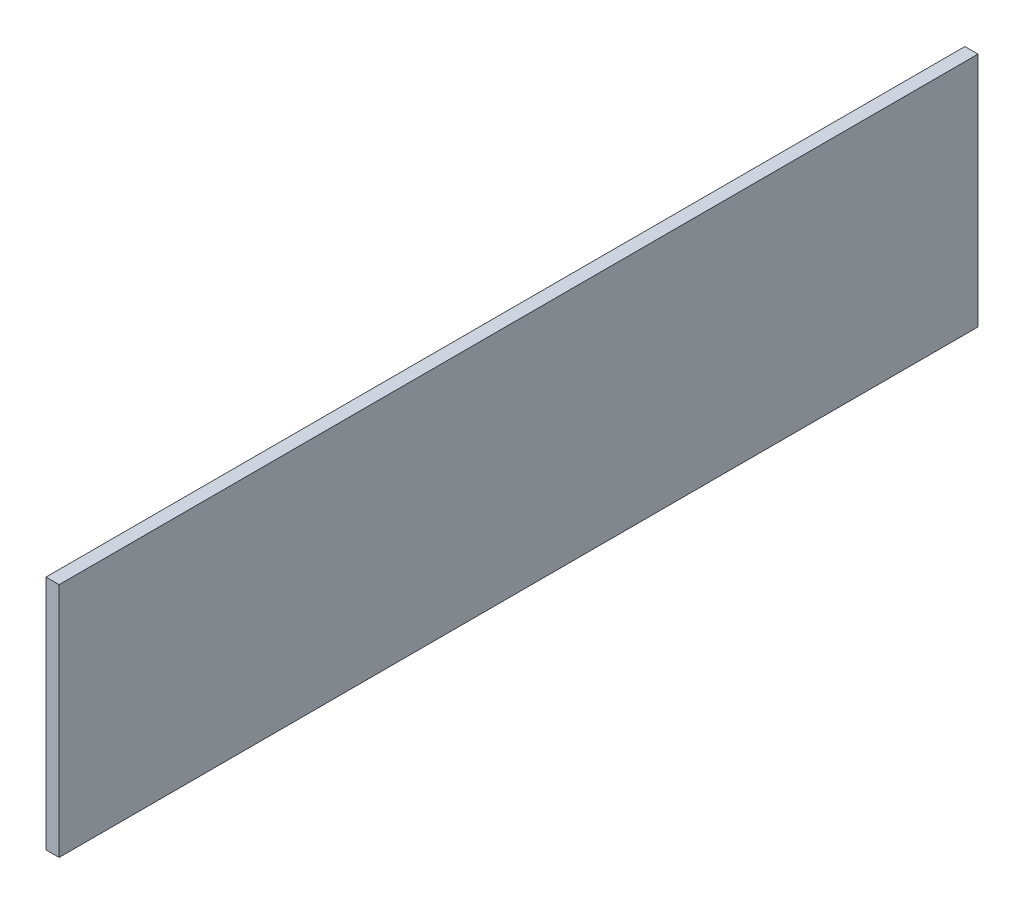
ISO-10303-21;
HEADER;
FILE_DESCRIPTION(('STEP AP214'),'2;1');
FILE_NAME('part.step','',(''),(''),'','','');
FILE_SCHEMA(('AUTOMOTIVE_DESIGN { 1 0 10303 214 1 1 1 1 }'));
ENDSEC;
DATA;
#1=APPLICATION_CONTEXT('core data for automotive mechanical design processes');
#2=APPLICATION_PROTOCOL_DEFINITION('international standard','automotive_design',2000,#1);
#3=PRODUCT_CONTEXT('',#1,'mechanical');
#4=PRODUCT('Part','Part','',(#3));
#5=PRODUCT_RELATED_PRODUCT_CATEGORY('part','',(#4));
#6=PRODUCT_DEFINITION_FORMATION('','',#4);
#7=PRODUCT_DEFINITION_CONTEXT('part definition',#1,'design');
#8=PRODUCT_DEFINITION('design','',#6,#7);
#9=PRODUCT_DEFINITION_SHAPE('','',#8);
#10=(LENGTH_UNIT() NAMED_UNIT(*) SI_UNIT(.MILLI.,.METRE.));
#11=(NAMED_UNIT(*) PLANE_ANGLE_UNIT() SI_UNIT($,.RADIAN.));
#12=(NAMED_UNIT(*) SI_UNIT($,.STERADIAN.) SOLID_ANGLE_UNIT());
#13=UNCERTAINTY_MEASURE_WITH_UNIT(LENGTH_MEASURE(1.E-05),#10,'distance_accuracy_value','');
#14=(GEOMETRIC_REPRESENTATION_CONTEXT(3) GLOBAL_UNCERTAINTY_ASSIGNED_CONTEXT((#13)) GLOBAL_UNIT_ASSIGNED_CONTEXT((#10,
#11,#12)) REPRESENTATION_CONTEXT('',''));
#15=CARTESIAN_POINT('',(0.,0.,0.));
#16=DIRECTION('',(0.,0.,1.));
#17=DIRECTION('',(1.,0.,0.));
#18=AXIS2_PLACEMENT_3D('',#15,#16,#17);
#19=CARTESIAN_POINT('',(1.,0.,0.));
#20=DIRECTION('',(0.,0.,-1.));
#21=DIRECTION('',(-1.,0.,0.));
#22=AXIS2_PLACEMENT_3D('',#19,#20,#21);
#23=PLANE('',#22);
#24=DIRECTION('',(0.,-1.,0.));
#25=VECTOR('',#24,1.);
#26=CARTESIAN_POINT('',(0.,0.,0.));
#27=LINE('',#26,#25);
#28=CARTESIAN_POINT('',(0.,18.,0.));
#29=VERTEX_POINT('',#28);
#30=CARTESIAN_POINT('',(0.,0.,0.));
#31=VERTEX_POINT('',#30);
#32=EDGE_CURVE('E107',#29,#31,#27,.T.);
#33=ORIENTED_EDGE('',*,*,#32,.T.);
#34=DIRECTION('',(-1.,0.,0.));
#35=VECTOR('',#34,1.);
#36=CARTESIAN_POINT('',(1.,0.,0.));
#37=LINE('',#36,#35);
#38=CARTESIAN_POINT('',(1.,0.,0.));
#39=VERTEX_POINT('',#38);
#40=EDGE_CURVE('E11',#39,#31,#37,.T.);
#41=ORIENTED_EDGE('',*,*,#40,.F.);
#42=DIRECTION('',(0.,-1.,0.));
#43=VECTOR('',#42,1.);
#44=CARTESIAN_POINT('',(1.,0.,0.));
#45=LINE('',#44,#43);
#46=CARTESIAN_POINT('',(1.,18.,0.));
#47=VERTEX_POINT('',#46);
#48=EDGE_CURVE('E91',#47,#39,#45,.T.);
#49=ORIENTED_EDGE('',*,*,#48,.F.);
#50=DIRECTION('',(-1.,0.,0.));
#51=VECTOR('',#50,1.);
#52=CARTESIAN_POINT('',(1.,18.,0.));
#53=LINE('',#52,#51);
#54=EDGE_CURVE('E103',#47,#29,#53,.T.);
#55=ORIENTED_EDGE('',*,*,#54,.T.);
#56=EDGE_LOOP('',(#33,#41,#49,#55));
#57=FACE_BOUND('',#56,.T.);
#58=ADVANCED_FACE('F39',(#57),#23,.F.);
#59=CARTESIAN_POINT('',(1.,0.,0.));
#60=DIRECTION('',(0.,1.,0.));
#61=DIRECTION('',(0.,0.,1.));
#62=AXIS2_PLACEMENT_3D('',#59,#60,#61);
#63=PLANE('',#62);
#64=DIRECTION('',(0.,0.,-1.));
#65=VECTOR('',#64,1.);
#66=CARTESIAN_POINT('',(0.,0.,0.));
#67=LINE('',#66,#65);
#68=CARTESIAN_POINT('',(0.,0.,-70.));
#69=VERTEX_POINT('',#68);
#70=EDGE_CURVE('E96',#31,#69,#67,.T.);
#71=ORIENTED_EDGE('',*,*,#70,.T.);
#72=DIRECTION('',(-1.,0.,0.));
#73=VECTOR('',#72,1.);
#74=CARTESIAN_POINT('',(1.,0.,-70.));
#75=LINE('',#74,#73);
#76=CARTESIAN_POINT('',(1.,0.,-70.));
#77=VERTEX_POINT('',#76);
#78=EDGE_CURVE('E48',#77,#69,#75,.T.);
#79=ORIENTED_EDGE('',*,*,#78,.F.);
#80=DIRECTION('',(0.,0.,-1.));
#81=VECTOR('',#80,1.);
#82=CARTESIAN_POINT('',(1.,0.,0.));
#83=LINE('',#82,#81);
#84=EDGE_CURVE('E86',#39,#77,#83,.T.);
#85=ORIENTED_EDGE('',*,*,#84,.F.);
#86=ORIENTED_EDGE('',*,*,#40,.T.);
#87=EDGE_LOOP('',(#71,#79,#85,#86));
#88=FACE_BOUND('',#87,.T.);
#89=ADVANCED_FACE('F95',(#88),#63,.F.);
#90=CARTESIAN_POINT('',(1.,0.,-70.));
#91=DIRECTION('',(0.,0.,1.));
#92=DIRECTION('',(1.,0.,0.));
#93=AXIS2_PLACEMENT_3D('',#90,#91,#92);
#94=PLANE('',#93);
#95=DIRECTION('',(0.,1.,0.));
#96=VECTOR('',#95,1.);
#97=CARTESIAN_POINT('',(0.,0.,-70.));
#98=LINE('',#97,#96);
#99=CARTESIAN_POINT('',(0.,18.,-70.));
#100=VERTEX_POINT('',#99);
#101=EDGE_CURVE('E73',#69,#100,#98,.T.);
#102=ORIENTED_EDGE('',*,*,#101,.T.);
#103=DIRECTION('',(-1.,0.,0.));
#104=VECTOR('',#103,1.);
#105=CARTESIAN_POINT('',(1.,18.,-70.));
#106=LINE('',#105,#104);
#107=CARTESIAN_POINT('',(1.,18.,-70.));
#108=VERTEX_POINT('',#107);
#109=EDGE_CURVE('E98',#108,#100,#106,.T.);
#110=ORIENTED_EDGE('',*,*,#109,.F.);
#111=DIRECTION('',(0.,1.,0.));
#112=VECTOR('',#111,1.);
#113=CARTESIAN_POINT('',(1.,0.,-70.));
#114=LINE('',#113,#112);
#115=EDGE_CURVE('E89',#77,#108,#114,.T.);
#116=ORIENTED_EDGE('',*,*,#115,.F.);
#117=ORIENTED_EDGE('',*,*,#78,.T.);
#118=EDGE_LOOP('',(#102,#110,#116,#117));
#119=FACE_BOUND('',#118,.T.);
#120=ADVANCED_FACE('F99',(#119),#94,.F.);
#121=CARTESIAN_POINT('',(1.,18.,0.));
#122=DIRECTION('',(0.,-1.,0.));
#123=DIRECTION('',(0.,0.,-1.));
#124=AXIS2_PLACEMENT_3D('',#121,#122,#123);
#125=PLANE('',#124);
#126=DIRECTION('',(0.,0.,1.));
#127=VECTOR('',#126,1.);
#128=CARTESIAN_POINT('',(0.,18.,0.));
#129=LINE('',#128,#127);
#130=EDGE_CURVE('E79',#100,#29,#129,.T.);
#131=ORIENTED_EDGE('',*,*,#130,.T.);
#132=ORIENTED_EDGE('',*,*,#54,.F.);
#133=DIRECTION('',(0.,0.,1.));
#134=VECTOR('',#133,1.);
#135=CARTESIAN_POINT('',(1.,18.,0.));
#136=LINE('',#135,#134);
#137=EDGE_CURVE('E56',#108,#47,#136,.T.);
#138=ORIENTED_EDGE('',*,*,#137,.F.);
#139=ORIENTED_EDGE('',*,*,#109,.T.);
#140=EDGE_LOOP('',(#131,#132,#138,#139));
#141=FACE_BOUND('',#140,.T.);
#142=ADVANCED_FACE('F120',(#141),#125,.F.);
#143=CARTESIAN_POINT('',(1.,0.,0.));
#144=DIRECTION('',(-1.,0.,0.));
#145=DIRECTION('',(0.,0.,1.));
#146=AXIS2_PLACEMENT_3D('',#143,#144,#145);
#147=PLANE('',#146);
#148=ORIENTED_EDGE('',*,*,#48,.T.);
#149=ORIENTED_EDGE('',*,*,#84,.T.);
#150=ORIENTED_EDGE('',*,*,#115,.T.);
#151=ORIENTED_EDGE('',*,*,#137,.T.);
#152=EDGE_LOOP('',(#148,#149,#150,#151));
#153=FACE_BOUND('',#152,.T.);
#154=ADVANCED_FACE('F87',(#153),#147,.F.);
#155=CARTESIAN_POINT('',(0.,0.,0.));
#156=DIRECTION('',(-1.,0.,0.));
#157=DIRECTION('',(0.,0.,1.));
#158=AXIS2_PLACEMENT_3D('',#155,#156,#157);
#159=PLANE('',#158);
#160=ORIENTED_EDGE('',*,*,#32,.F.);
#161=ORIENTED_EDGE('',*,*,#130,.F.);
#162=ORIENTED_EDGE('',*,*,#101,.F.);
#163=ORIENTED_EDGE('',*,*,#70,.F.);
#164=EDGE_LOOP('',(#160,#161,#162,#163));
#165=FACE_BOUND('',#164,.T.);
#166=ADVANCED_FACE('F123',(#165),#159,.T.);
#167=CLOSED_SHELL('',(#58,#89,#120,#142,#154,#166));
#168=MANIFOLD_SOLID_BREP('B2',#167);
#169=ADVANCED_BREP_SHAPE_REPRESENTATION('',(#18,#168),#14);
#170=SHAPE_DEFINITION_REPRESENTATION(#9,#169);
ENDSEC;
END-ISO-10303-21;
